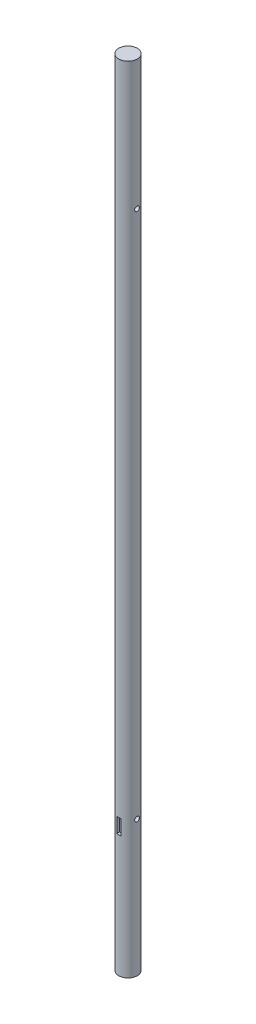
ISO-10303-21;
HEADER;
FILE_DESCRIPTION(('STEP AP214'),'2;1');
FILE_NAME('part.step','',(''),(''),'','','');
FILE_SCHEMA(('AUTOMOTIVE_DESIGN { 1 0 10303 214 1 1 1 1 }'));
ENDSEC;
DATA;
#1=APPLICATION_CONTEXT('core data for automotive mechanical design processes');
#2=APPLICATION_PROTOCOL_DEFINITION('international standard','automotive_design',2000,#1);
#3=PRODUCT_CONTEXT('',#1,'mechanical');
#4=PRODUCT('Part','Part','',(#3));
#5=PRODUCT_RELATED_PRODUCT_CATEGORY('part','',(#4));
#6=PRODUCT_DEFINITION_FORMATION('','',#4);
#7=PRODUCT_DEFINITION_CONTEXT('part definition',#1,'design');
#8=PRODUCT_DEFINITION('design','',#6,#7);
#9=PRODUCT_DEFINITION_SHAPE('','',#8);
#10=(LENGTH_UNIT() NAMED_UNIT(*) SI_UNIT(.MILLI.,.METRE.));
#11=(NAMED_UNIT(*) PLANE_ANGLE_UNIT() SI_UNIT($,.RADIAN.));
#12=(NAMED_UNIT(*) SI_UNIT($,.STERADIAN.) SOLID_ANGLE_UNIT());
#13=UNCERTAINTY_MEASURE_WITH_UNIT(LENGTH_MEASURE(1.E-05),#10,'distance_accuracy_value','');
#14=(GEOMETRIC_REPRESENTATION_CONTEXT(3) GLOBAL_UNCERTAINTY_ASSIGNED_CONTEXT((#13)) GLOBAL_UNIT_ASSIGNED_CONTEXT((#10,
#11,#12)) REPRESENTATION_CONTEXT('',''));
#15=CARTESIAN_POINT('',(0.,0.,0.));
#16=DIRECTION('',(0.,0.,1.));
#17=DIRECTION('',(1.,0.,0.));
#18=AXIS2_PLACEMENT_3D('',#15,#16,#17);
#19=CARTESIAN_POINT('',(0.,1600.,0.));
#20=DIRECTION('',(0.,-1.,0.));
#21=DIRECTION('',(0.,0.,-1.));
#22=AXIS2_PLACEMENT_3D('',#19,#20,#21);
#23=CYLINDRICAL_SURFACE('',#22,18.75);
#24=CARTESIAN_POINT('',(-18.75,1333.7975,0.));
#25=CARTESIAN_POINT('',(-18.7499956498863,1333.79750712746,-0.262993618249077));
#26=CARTESIAN_POINT('',(-18.7444117782007,1333.81935768293,-0.526066057474243));
#27=CARTESIAN_POINT('',(-18.7226779536651,1333.90604610928,-1.04466217030654));
#28=CARTESIAN_POINT('',(-18.7065222249169,1333.97090747923,-1.30018163756687));
#29=CARTESIAN_POINT('',(-18.6654323155867,1334.14139518578,-1.7961086949405));
#30=CARTESIAN_POINT('',(-18.6405088635419,1334.24697171679,-2.03653433265144));
#31=CARTESIAN_POINT('',(-18.5845330665217,1334.4957153675,-2.49626318263941));
#32=CARTESIAN_POINT('',(-18.5534804667271,1334.63888405017,-2.71556551615116));
#33=CARTESIAN_POINT('',(-18.4878768948386,1334.96195463644,-3.13147328009704));
#34=CARTESIAN_POINT('',(-18.4532705620118,1335.14250415991,-3.32756693949907));
#35=CARTESIAN_POINT('',(-18.3848247442538,1335.53382524314,-3.68704169111168));
#36=CARTESIAN_POINT('',(-18.3509853490632,1335.74460031873,-3.85041897247021));
#37=CARTESIAN_POINT('',(-18.2873448044607,1336.19438915472,-4.14225086158357));
#38=CARTESIAN_POINT('',(-18.2576138363475,1336.43378766201,-4.27012917342949));
#39=CARTESIAN_POINT('',(-18.2063653200901,1336.93156177627,-4.48362568775791));
#40=CARTESIAN_POINT('',(-18.184846412265,1337.18993423325,-4.56925088682912));
#41=CARTESIAN_POINT('',(-18.1530280610375,1337.71268495611,-4.69405731561));
#42=CARTESIAN_POINT('',(-18.1425062450035,1337.97682924112,-4.73416054769972));
#43=CARTESIAN_POINT('',(-18.1332080653267,1338.50828987065,-4.76965717287876));
#44=CARTESIAN_POINT('',(-18.1344297250435,1338.77560567378,-4.76505809017799));
#45=CARTESIAN_POINT('',(-18.1482807711457,1339.29872461741,-4.71201540420198));
#46=CARTESIAN_POINT('',(-18.1606232570157,1339.55464834779,-4.66467441542128));
#47=CARTESIAN_POINT('',(-18.1948675423693,1340.0547965968,-4.529252322924));
#48=CARTESIAN_POINT('',(-18.2167700423947,1340.29902025662,-4.44116823359355));
#49=CARTESIAN_POINT('',(-18.2679272240216,1340.77177296687,-4.22583040076505));
#50=CARTESIAN_POINT('',(-18.2972558371072,1341.00011286664,-4.09817969831814));
#51=CARTESIAN_POINT('',(-18.3599193828103,1341.43252490685,-3.80760962956653));
#52=CARTESIAN_POINT('',(-18.3932550367408,1341.63659266485,-3.64468390911577));
#53=CARTESIAN_POINT('',(-18.4613813509344,1342.02098196775,-3.28249451712199));
#54=CARTESIAN_POINT('',(-18.4961859381833,1342.20042643566,-3.08230142879544));
#55=CARTESIAN_POINT('',(-18.5624437536014,1342.52336601453,-2.65424503877228));
#56=CARTESIAN_POINT('',(-18.5938968727751,1342.66685995652,-2.42638083767948));
#57=CARTESIAN_POINT('',(-18.6500727071844,1342.91416218477,-1.94817401280542));
#58=CARTESIAN_POINT('',(-18.674770521735,1343.01782420018,-1.69775263073237));
#59=CARTESIAN_POINT('',(-18.7144721803579,1343.18133296329,-1.18226997587645));
#60=CARTESIAN_POINT('',(-18.729477940307,1343.24118837077,-0.917211607711538));
#61=CARTESIAN_POINT('',(-18.7478197680714,1343.31403655094,-0.387474645550518));
#62=CARTESIAN_POINT('',(-18.7514530791963,1343.32822326106,-0.122970287608625));
#63=CARTESIAN_POINT('',(-18.7474891106675,1343.31261127999,0.404634350488734));
#64=CARTESIAN_POINT('',(-18.7398928768053,1343.2828166847,0.667734759101962));
#65=CARTESIAN_POINT('',(-18.7145141873443,1343.18107090993,1.18088779336107));
#66=CARTESIAN_POINT('',(-18.6968900364678,1343.10977450071,1.43107878463828));
#67=CARTESIAN_POINT('',(-18.6534447093839,1342.9277997552,1.91593397218049));
#68=CARTESIAN_POINT('',(-18.6276226902461,1342.81711736898,2.15059656876791));
#69=CARTESIAN_POINT('',(-18.5699375889345,1342.55722204578,2.60245803441006));
#70=CARTESIAN_POINT('',(-18.5379731680015,1342.40734488924,2.81926161587298));
#71=CARTESIAN_POINT('',(-18.471703024662,1342.07416017813,3.22506366917098));
#72=CARTESIAN_POINT('',(-18.4373968851515,1341.89084665813,3.41405716849244));
#73=CARTESIAN_POINT('',(-18.3692342168533,1341.49044222684,3.76382066038847));
#74=CARTESIAN_POINT('',(-18.335411236728,1341.27261168546,3.92375192074105));
#75=CARTESIAN_POINT('',(-18.2730132418387,1340.81250339591,4.20479390431572));
#76=CARTESIAN_POINT('',(-18.2444379962126,1340.57022672393,4.32590633545797));
#77=CARTESIAN_POINT('',(-18.196089627051,1340.06938714157,4.52496628090202));
#78=CARTESIAN_POINT('',(-18.1762645932386,1339.81093095712,4.6031690472031));
#79=CARTESIAN_POINT('',(-18.1476194807122,1339.28395619481,4.71484821792432));
#80=CARTESIAN_POINT('',(-18.1387969020621,1339.01543991707,4.74833478271257));
#81=CARTESIAN_POINT('',(-18.1333505136191,1338.4845139955,4.76908729521345));
#82=CARTESIAN_POINT('',(-18.1363724387453,1338.22215962443,4.75769548701856));
#83=CARTESIAN_POINT('',(-18.1534530586462,1337.70324436428,4.69209632919892));
#84=CARTESIAN_POINT('',(-18.1675115175998,1337.44668335153,4.63788989440771));
#85=CARTESIAN_POINT('',(-18.2048805096093,1336.94815092884,4.48894412822459));
#86=CARTESIAN_POINT('',(-18.228131758468,1336.70609726017,4.39446422071157));
#87=CARTESIAN_POINT('',(-18.281273133895,1336.241101456,4.16785757028521));
#88=CARTESIAN_POINT('',(-18.3111642102766,1336.01816206109,4.03572544053554));
#89=CARTESIAN_POINT('',(-18.3752209781056,1335.59125557792,3.73339002067371));
#90=CARTESIAN_POINT('',(-18.4094799634597,1335.3879594258,3.56225896868237));
#91=CARTESIAN_POINT('',(-18.4778641545165,1335.01253306875,3.18858126717575));
#92=CARTESIAN_POINT('',(-18.511989326342,1334.84041031306,2.98602713016889));
#93=CARTESIAN_POINT('',(-18.5770294024012,1334.52904483705,2.5506419389618));
#94=CARTESIAN_POINT('',(-18.607871614748,1334.39048352761,2.31731187061552));
#95=CARTESIAN_POINT('',(-18.6620975101127,1334.15477313073,1.82990427397952));
#96=CARTESIAN_POINT('',(-18.6854864054118,1334.05759508693,1.57584140149858));
#97=CARTESIAN_POINT('',(-18.7188134137392,1333.92142743101,1.10195225387384));
#98=CARTESIAN_POINT('',(-18.7304269191351,1333.87505681853,0.884335172620964));
#99=CARTESIAN_POINT('',(-18.7460217439955,1333.81309132729,0.444497248049597));
#100=CARTESIAN_POINT('',(-18.7500036766263,1333.79749397602,0.222276776045352));
#101=CARTESIAN_POINT('',(-18.75,1333.7975,0.));
#102=B_SPLINE_CURVE_WITH_KNOTS('',3,(#24,#25,#26,#27,#28,#29,#30,#31,#32,#33,#34,#35,#36,#37,
#38,#39,#40,#41,#42,#43,#44,#45,#46,#47,#48,#49,#50,#51,#52,#53,#54,#55,#56,#57,#58,#59,#60,#61,
#62,#63,#64,#65,#66,#67,#68,#69,#70,#71,#72,#73,#74,#75,#76,#77,#78,#79,#80,#81,#82,#83,#84,#85,
#86,#87,#88,#89,#90,#91,#92,#93,#94,#95,#96,#97,#98,#99,#100,#101),.UNSPECIFIED.,.T.,.F.,(4,2,2,
2,2,2,2,2,2,2,2,2,2,2,2,2,2,2,2,2,2,2,2,2,2,2,2,2,2,2,2,2,2,2,2,2,2,2,4),(0.,0.788166156437042,
1.57676328471038,2.36439879134056,3.15206705080354,3.95473556235158,4.75749751559844,
5.57261678252078,6.38760103052476,7.18576635861262,7.98379734333403,8.76181188104456,
9.53988343992068,10.3260286416716,11.1123155710209,11.9217754126391,12.7312615712346,
13.5436925464945,14.3559628752787,15.146817504299,15.9375984868084,16.7162291133077,
17.4949398269732,18.2878146339146,19.0808310370768,19.8939884656592,20.707110112671,
21.5153408934219,22.3233879975614,23.1074538242315,23.8915028979746,24.6705760324132,
25.4497606834655,26.2498867759458,27.0502038161126,27.8656162468153,28.6804571824867,
29.3466524727938,30.0127942347393),.UNSPECIFIED.);
#103=CARTESIAN_POINT('',(-18.75,1333.7975,0.));
#104=VERTEX_POINT('',#103);
#105=EDGE_CURVE('E11',#104,#104,#102,.T.);
#106=ORIENTED_EDGE('',*,*,#105,.T.);
#107=EDGE_LOOP('',(#106));
#108=FACE_BOUND('',#107,.T.);
#109=CARTESIAN_POINT('',(18.1350790941203,1338.56,-4.76250000000006));
#110=CARTESIAN_POINT('',(18.1350840232791,1338.29716070885,-4.76249278384175));
#111=CARTESIAN_POINT('',(18.1408556693656,1338.03424241254,-4.7406669840311));
#112=CARTESIAN_POINT('',(18.1632573253463,1337.51596604457,-4.65408578491313));
#113=CARTESIAN_POINT('',(18.1798934485058,1337.26061231398,-4.58930621590089));
#114=CARTESIAN_POINT('',(18.2220210958878,1336.76503679324,-4.41905754600954));
#115=CARTESIAN_POINT('',(18.247500946094,1336.5247955455,-4.31364206570295));
#116=CARTESIAN_POINT('',(18.3044304977109,1336.06537915195,-4.06527837377646));
#117=CARTESIAN_POINT('',(18.3358805025385,1335.84620507768,-3.92232825441931));
#118=CARTESIAN_POINT('',(18.4020064649526,1335.43016729564,-3.59948465510579));
#119=CARTESIAN_POINT('',(18.4367353109821,1335.23385262652,-3.41889433991612));
#120=CARTESIAN_POINT('',(18.5050476371812,1334.87394712047,-3.02739704454027));
#121=CARTESIAN_POINT('',(18.5386310073552,1334.71035941887,-2.81648716296511));
#122=CARTESIAN_POINT('',(18.6014547773595,1334.41829507181,-2.36656561755999));
#123=CARTESIAN_POINT('',(18.6306254928042,1334.29035931009,-2.1271922687535));
#124=CARTESIAN_POINT('',(18.6807330148893,1334.07674981584,-1.62947199037149));
#125=CARTESIAN_POINT('',(18.7016710767475,1333.99106964015,-1.37112796035547));
#126=CARTESIAN_POINT('',(18.7325802344397,1333.86616635806,-0.848525212785491));
#127=CARTESIAN_POINT('',(18.7427712079791,1333.8260105148,-0.584502651628614));
#128=CARTESIAN_POINT('',(18.7518047607337,1333.79036638311,-0.0532848837864862));
#129=CARTESIAN_POINT('',(18.7506490697218,1333.79487128625,0.213909833107982));
#130=CARTESIAN_POINT('',(18.737282581493,1333.84775320954,0.737412747324913));
#131=CARTESIAN_POINT('',(18.7253255481778,1333.89512321201,0.993830126861042));
#132=CARTESIAN_POINT('',(18.6919962826316,1334.03077008969,1.49495010084054));
#133=CARTESIAN_POINT('',(18.6706235403207,1334.11904918109,1.73965205982471));
#134=CARTESIAN_POINT('',(18.6204788916185,1334.33481294353,2.21302870978919));
#135=CARTESIAN_POINT('',(18.5916403468194,1334.46265284608,2.44153413831019));
#136=CARTESIAN_POINT('',(18.5296874262595,1334.75363912486,2.87419952702094));
#137=CARTESIAN_POINT('',(18.4965722856978,1334.91679181977,3.0783551200384));
#138=CARTESIAN_POINT('',(18.4285792892393,1335.27915849352,3.46253267789726));
#139=CARTESIAN_POINT('',(18.3936780323407,1335.47925208535,3.64172173493411));
#140=CARTESIAN_POINT('',(18.3268896015694,1335.90701332632,3.9641912721064));
#141=CARTESIAN_POINT('',(18.2950025781184,1336.13468235028,4.10746996076754));
#142=CARTESIAN_POINT('',(18.2377667445291,1336.61280580133,4.35460820210048));
#143=CARTESIAN_POINT('',(18.2124524076859,1336.86337140322,4.4582612095122));
#144=CARTESIAN_POINT('',(18.1716668448211,1337.37917158893,4.62170939528255));
#145=CARTESIAN_POINT('',(18.1561934351495,1337.64440290429,4.68151430375489));
#146=CARTESIAN_POINT('',(18.1373016311342,1338.17426594969,4.75417413390824));
#147=CARTESIAN_POINT('',(18.133566460057,1338.43871735475,4.7682631279792));
#148=CARTESIAN_POINT('',(18.137710736794,1338.96619402345,4.75247479032553));
#149=CARTESIAN_POINT('',(18.1455890769031,1339.2292194207,4.72260165174152));
#150=CARTESIAN_POINT('',(18.1717685547933,1339.74175511577,4.62082050101553));
#151=CARTESIAN_POINT('',(18.1898900501808,1339.99141923199,4.54963643182574));
#152=CARTESIAN_POINT('',(18.2343422874638,1340.47526962722,4.36805938518873));
#153=CARTESIAN_POINT('',(18.2606740257214,1340.70945402349,4.25766164870211));
#154=CARTESIAN_POINT('',(18.3192428392186,1341.16091076694,3.99822634434617));
#155=CARTESIAN_POINT('',(18.351588353011,1341.37774650511,3.84845403876097));
#156=CARTESIAN_POINT('',(18.4182767433469,1341.78366096485,3.51544579687777));
#157=CARTESIAN_POINT('',(18.4526199585166,1341.97273496134,3.33220417593401));
#158=CARTESIAN_POINT('',(18.5205117088812,1342.32278681796,2.93178477271905));
#159=CARTESIAN_POINT('',(18.5540165695694,1342.48290935287,2.71385044655678));
#160=CARTESIAN_POINT('',(18.6155368857075,1342.76428752198,2.25347236951465));
#161=CARTESIAN_POINT('',(18.6435526296287,1342.88554519886,2.01102990763455));
#162=CARTESIAN_POINT('',(18.6907601643679,1343.0846828565,1.51020462078283));
#163=CARTESIAN_POINT('',(18.7100159289241,1343.16287823367,1.25195351996896));
#164=CARTESIAN_POINT('',(18.7378143444856,1343.27461161928,0.725420459169228));
#165=CARTESIAN_POINT('',(18.7463591342984,1343.30815854337,0.457140512802819));
#166=CARTESIAN_POINT('',(18.7516823114806,1343.32912774451,-0.0738100545499679));
#167=CARTESIAN_POINT('',(18.7487822451389,1343.31781045281,-0.336428414374281));
#168=CARTESIAN_POINT('',(18.7322579216821,1343.25226875242,-0.855892018691095));
#169=CARTESIAN_POINT('',(18.7186340025078,1343.19804569582,-1.11273744484369));
#170=CARTESIAN_POINT('',(18.6822458632328,1343.04891658113,-1.61199861788453));
#171=CARTESIAN_POINT('',(18.6595343724839,1342.9542450087,-1.85448850029879));
#172=CARTESIAN_POINT('',(18.6073585866202,1342.7271179552,-2.32027966170035));
#173=CARTESIAN_POINT('',(18.5778934166715,1342.59465757865,-2.5435784496235));
#174=CARTESIAN_POINT('',(18.5144759366867,1342.29190534479,-2.97060016732835));
#175=CARTESIAN_POINT('',(18.4804310579245,1342.12076282554,-3.17370623626745));
#176=CARTESIAN_POINT('',(18.412097483349,1341.74714700891,-3.54874405166371));
#177=CARTESIAN_POINT('',(18.3778087274334,1341.54466571362,-3.72066781575841));
#178=CARTESIAN_POINT('',(18.3121094314498,1341.10938650883,-4.03174583249094));
#179=CARTESIAN_POINT('',(18.2807677286439,1340.8760761563,-4.17019876157238));
#180=CARTESIAN_POINT('',(18.225447664527,1340.38872632612,-4.40571154055518));
#181=CARTESIAN_POINT('',(18.2014640740766,1340.13470173258,-4.50280080524926));
#182=CARTESIAN_POINT('',(18.1672269551572,1339.66102854693,-4.63878176807623));
#183=CARTESIAN_POINT('',(18.1552637964512,1339.44359872545,-4.68507318409058));
#184=CARTESIAN_POINT('',(18.139188142582,1339.00413112327,-4.74693394326758));
#185=CARTESIAN_POINT('',(18.135074929083,1338.78209376609,-4.76250609750462));
#186=CARTESIAN_POINT('',(18.1350790941203,1338.56,-4.76250000000006));
#187=B_SPLINE_CURVE_WITH_KNOTS('',3,(#109,#110,#111,#112,#113,#114,#115,#116,#117,#118,#119,
#120,#121,#122,#123,#124,#125,#126,#127,#128,#129,#130,#131,#132,#133,#134,#135,#136,#137,#138,
#139,#140,#141,#142,#143,#144,#145,#146,#147,#148,#149,#150,#151,#152,#153,#154,#155,#156,#157,
#158,#159,#160,#161,#162,#163,#164,#165,#166,#167,#168,#169,#170,#171,#172,#173,#174,#175,#176,
#177,#178,#179,#180,#181,#182,#183,#184,#185,#186),.UNSPECIFIED.,.T.,.F.,(4,2,2,2,2,2,2,2,2,2,2,
2,2,2,2,2,2,2,2,2,2,2,2,2,2,2,2,2,2,2,2,2,2,2,2,2,2,2,4),(0.,0.787702028900706,1.57584766730428,
2.36295685909409,3.15010606427788,3.9533809678661,4.75673279096744,5.57168037278601,
6.38650365278424,7.18431213789905,7.98199900083229,8.76141912804849,9.54088148421008,
10.3275566322943,11.1143726600236,11.9231555335073,12.7319787470247,13.5449621904392,
14.357765174092,15.1484361283671,15.9390316727513,16.7161739301164,17.493410535071,
18.2863304890438,19.0793852431333,19.8929969115238,20.7065658104376,21.5140939204177,
22.3214607544599,23.1063081317562,23.8911307771508,24.6714641460416,25.4518986521462,
26.2515360153748,27.051377789854,27.8667545381526,28.6815504787595,29.3472033209905,
30.0127952474843),.UNSPECIFIED.);
#188=CARTESIAN_POINT('',(18.1350790941203,1338.56,-4.76250000000006));
#189=VERTEX_POINT('',#188);
#190=EDGE_CURVE('E68',#189,#189,#187,.T.);
#191=ORIENTED_EDGE('',*,*,#190,.T.);
#192=EDGE_LOOP('',(#191));
#193=FACE_BOUND('',#192,.T.);
#194=CARTESIAN_POINT('',(-18.75,268.7975,0.));
#195=CARTESIAN_POINT('',(-18.7499956498863,268.797507127463,-0.262993618249073));
#196=CARTESIAN_POINT('',(-18.7444117782007,268.819357682928,-0.526066057474233));
#197=CARTESIAN_POINT('',(-18.7226779536651,268.906046109277,-1.04466217030652));
#198=CARTESIAN_POINT('',(-18.7065222249169,268.970907479231,-1.30018163756685));
#199=CARTESIAN_POINT('',(-18.6654323155867,269.141395185775,-1.79610869494049));
#200=CARTESIAN_POINT('',(-18.6405088635419,269.246971716793,-2.03653433265144));
#201=CARTESIAN_POINT('',(-18.5845330665217,269.4957153675,-2.49626318263943));
#202=CARTESIAN_POINT('',(-18.5534804667271,269.638884050165,-2.7155655161512));
#203=CARTESIAN_POINT('',(-18.4878768948385,269.961954636444,-3.13147328009712));
#204=CARTESIAN_POINT('',(-18.4532705620118,270.142504159907,-3.32756693949919));
#205=CARTESIAN_POINT('',(-18.3848247442538,270.533825243145,-3.68704169111178));
#206=CARTESIAN_POINT('',(-18.3509853490632,270.744600318734,-3.85041897247027));
#207=CARTESIAN_POINT('',(-18.2873448044607,271.194389154715,-4.14225086158357));
#208=CARTESIAN_POINT('',(-18.2576138363475,271.433787662007,-4.27012917342948));
#209=CARTESIAN_POINT('',(-18.2063653200901,271.931561776274,-4.4836256877579));
#210=CARTESIAN_POINT('',(-18.184846412265,272.189934233253,-4.5692508868291));
#211=CARTESIAN_POINT('',(-18.1530280610375,272.712684956113,-4.69405731560993));
#212=CARTESIAN_POINT('',(-18.1425062450035,272.976829241123,-4.73416054769964));
#213=CARTESIAN_POINT('',(-18.1332080653267,273.508289870651,-4.76965717287871));
#214=CARTESIAN_POINT('',(-18.1344297250435,273.77560567378,-4.76505809017793));
#215=CARTESIAN_POINT('',(-18.1482807711458,274.298724617411,-4.71201540420191));
#216=CARTESIAN_POINT('',(-18.1606232570157,274.554648347791,-4.6646744154212));
#217=CARTESIAN_POINT('',(-18.1948675423693,275.054796596804,-4.52925232292391));
#218=CARTESIAN_POINT('',(-18.2167700423947,275.29902025662,-4.44116823359346));
#219=CARTESIAN_POINT('',(-18.2679272240217,275.771772966865,-4.22583040076496));
#220=CARTESIAN_POINT('',(-18.2972558371072,276.000112866635,-4.09817969831802));
#221=CARTESIAN_POINT('',(-18.3599193828103,276.432524906854,-3.80760962956636));
#222=CARTESIAN_POINT('',(-18.3932550367408,276.636592664849,-3.64468390911561));
#223=CARTESIAN_POINT('',(-18.4613813509344,277.020981967754,-3.28249451712188));
#224=CARTESIAN_POINT('',(-18.4961859381833,277.200426435658,-3.08230142879538));
#225=CARTESIAN_POINT('',(-18.5624437536014,277.523366014526,-2.65424503877227));
#226=CARTESIAN_POINT('',(-18.5938968727751,277.666859956523,-2.42638083767947));
#227=CARTESIAN_POINT('',(-18.6500727071844,277.914162184767,-1.94817401280537));
#228=CARTESIAN_POINT('',(-18.674770521735,278.017824200177,-1.6977526307323));
#229=CARTESIAN_POINT('',(-18.7144721803579,278.181332963289,-1.18226997587631));
#230=CARTESIAN_POINT('',(-18.729477940307,278.241188370772,-0.917211607711362));
#231=CARTESIAN_POINT('',(-18.7478197680714,278.314036550939,-0.387474645550309));
#232=CARTESIAN_POINT('',(-18.7514530791963,278.328223261065,-0.122970287608426));
#233=CARTESIAN_POINT('',(-18.7474891106675,278.312611279985,0.4046343504889));
#234=CARTESIAN_POINT('',(-18.7398928768052,278.282816684696,0.667734759102105));
#235=CARTESIAN_POINT('',(-18.7145141873443,278.18107090993,1.18088779336118));
#236=CARTESIAN_POINT('',(-18.6968900364678,278.109774500713,1.43107878463838));
#237=CARTESIAN_POINT('',(-18.6534447093839,277.927799755201,1.91593397218059));
#238=CARTESIAN_POINT('',(-18.6276226902461,277.817117368978,2.15059656876802));
#239=CARTESIAN_POINT('',(-18.5699375889344,277.557222045777,2.60245803441013));
#240=CARTESIAN_POINT('',(-18.5379731680015,277.407344889244,2.819261615873));
#241=CARTESIAN_POINT('',(-18.471703024662,277.074160178129,3.22506366917097));
#242=CARTESIAN_POINT('',(-18.4373968851515,276.890846658132,3.41405716849246));
#243=CARTESIAN_POINT('',(-18.3692342168533,276.490442226844,3.76382066038847));
#244=CARTESIAN_POINT('',(-18.335411236728,276.272611685455,3.92375192074102));
#245=CARTESIAN_POINT('',(-18.2730132418387,275.812503395908,4.20479390431569));
#246=CARTESIAN_POINT('',(-18.2444379962126,275.570226723927,4.32590633545797));
#247=CARTESIAN_POINT('',(-18.196089627051,275.069387141572,4.52496628090204));
#248=CARTESIAN_POINT('',(-18.1762645932386,274.810930957119,4.60316904720313));
#249=CARTESIAN_POINT('',(-18.1476194807122,274.283956194814,4.71484821792434));
#250=CARTESIAN_POINT('',(-18.1387969020621,274.015439917067,4.74833478271258));
#251=CARTESIAN_POINT('',(-18.1333505136191,273.484513995499,4.76908729521344));
#252=CARTESIAN_POINT('',(-18.1363724387453,273.222159624427,4.75769548701856));
#253=CARTESIAN_POINT('',(-18.1534530586462,272.703244364275,4.69209632919895));
#254=CARTESIAN_POINT('',(-18.1675115175998,272.446683351527,4.63788989440773));
#255=CARTESIAN_POINT('',(-18.2048805096094,271.948150928839,4.48894412822456));
#256=CARTESIAN_POINT('',(-18.228131758468,271.706097260172,4.39446422071153));
#257=CARTESIAN_POINT('',(-18.281273133895,271.241101456004,4.16785757028518));
#258=CARTESIAN_POINT('',(-18.3111642102766,271.01816206109,4.03572544053552));
#259=CARTESIAN_POINT('',(-18.3752209781056,270.591255577922,3.73339002067369));
#260=CARTESIAN_POINT('',(-18.4094799634597,270.387959425796,3.56225896868232));
#261=CARTESIAN_POINT('',(-18.4778641545166,270.012533068747,3.18858126717565));
#262=CARTESIAN_POINT('',(-18.511989326342,269.840410313061,2.98602713016877));
#263=CARTESIAN_POINT('',(-18.5770294024012,269.529044837047,2.55064193896167));
#264=CARTESIAN_POINT('',(-18.607871614748,269.390483527606,2.31731187061541));
#265=CARTESIAN_POINT('',(-18.6620975101127,269.154773130729,1.82990427397946));
#266=CARTESIAN_POINT('',(-18.6854864054119,269.057595086929,1.57584140149854));
#267=CARTESIAN_POINT('',(-18.7188134137392,268.921427431009,1.10195225387381));
#268=CARTESIAN_POINT('',(-18.7304269191351,268.875056818531,0.884335172620934));
#269=CARTESIAN_POINT('',(-18.7460217439955,268.81309132729,0.444497248049572));
#270=CARTESIAN_POINT('',(-18.7500036766263,268.797493976015,0.222276776045339));
#271=CARTESIAN_POINT('',(-18.75,268.7975,0.));
#272=B_SPLINE_CURVE_WITH_KNOTS('',3,(#194,#195,#196,#197,#198,#199,#200,#201,#202,#203,#204,
#205,#206,#207,#208,#209,#210,#211,#212,#213,#214,#215,#216,#217,#218,#219,#220,#221,#222,#223,
#224,#225,#226,#227,#228,#229,#230,#231,#232,#233,#234,#235,#236,#237,#238,#239,#240,#241,#242,
#243,#244,#245,#246,#247,#248,#249,#250,#251,#252,#253,#254,#255,#256,#257,#258,#259,#260,#261,
#262,#263,#264,#265,#266,#267,#268,#269,#270,#271),.UNSPECIFIED.,.T.,.F.,(4,2,2,2,2,2,2,2,2,2,2,
2,2,2,2,2,2,2,2,2,2,2,2,2,2,2,2,2,2,2,2,2,2,2,2,2,2,2,4),(0.,0.788166156437031,1.5767632847104,
2.36439879134054,3.15206705080355,3.95473556235177,4.75749751559863,5.57261678252073,
6.38760103052486,7.18576635861228,7.98379734333386,8.76181188104467,9.53988343992067,
10.3260286416718,11.1123155710209,11.9217754126389,12.7312615712345,13.5436925464944,
14.3559628752787,15.146817504299,15.9375984868084,16.7162291133076,17.4949398269731,
18.2878146339144,19.0808310370767,19.8939884656589,20.7071101126708,21.5153408934218,
22.3233879975613,23.1074538242311,23.8915028979746,24.670576032413,25.4497606834653,
26.2498867759457,27.0502038161126,27.8656162468151,28.6804571824865,29.3466524727936,
30.0127942347391),.UNSPECIFIED.);
#273=CARTESIAN_POINT('',(-18.75,268.7975,0.));
#274=VERTEX_POINT('',#273);
#275=EDGE_CURVE('E236',#274,#274,#272,.T.);
#276=ORIENTED_EDGE('',*,*,#275,.T.);
#277=EDGE_LOOP('',(#276));
#278=FACE_BOUND('',#277,.T.);
#279=CARTESIAN_POINT('',(18.1350790941203,273.56,-4.7625));
#280=CARTESIAN_POINT('',(18.1350840232792,273.297160708853,-4.76249278384169));
#281=CARTESIAN_POINT('',(18.1408556693656,273.034242412541,-4.74066698403104));
#282=CARTESIAN_POINT('',(18.1632573253463,272.515966044568,-4.65408578491311));
#283=CARTESIAN_POINT('',(18.1798934485058,272.260612313981,-4.58930621590086));
#284=CARTESIAN_POINT('',(18.2220210958878,271.765036793236,-4.4190575460095));
#285=CARTESIAN_POINT('',(18.247500946094,271.524795545496,-4.31364206570288));
#286=CARTESIAN_POINT('',(18.3044304977109,271.065379151951,-4.06527837377639));
#287=CARTESIAN_POINT('',(18.3358805025385,270.846205077681,-3.92232825441926));
#288=CARTESIAN_POINT('',(18.4020064649526,270.430167295636,-3.59948465510578));
#289=CARTESIAN_POINT('',(18.4367353109821,270.233852626524,-3.41889433991612));
#290=CARTESIAN_POINT('',(18.5050476371812,269.873947120465,-3.02739704454027));
#291=CARTESIAN_POINT('',(18.5386310073552,269.710359418869,-2.81648716296509));
#292=CARTESIAN_POINT('',(18.6014547773595,269.418295071805,-2.36656561756));
#293=CARTESIAN_POINT('',(18.6306254928042,269.290359310094,-2.12719226875357));
#294=CARTESIAN_POINT('',(18.6807330148893,269.076749815839,-1.62947199037159));
#295=CARTESIAN_POINT('',(18.7016710767475,268.991069640154,-1.37112796035555));
#296=CARTESIAN_POINT('',(18.7325802344397,268.866166358064,-0.848525212785571));
#297=CARTESIAN_POINT('',(18.7427712079791,268.826010514803,-0.5845026516287));
#298=CARTESIAN_POINT('',(18.7518047607337,268.790366383108,-0.0532848837865789));
#299=CARTESIAN_POINT('',(18.7506490697218,268.794871286246,0.213909833107889));
#300=CARTESIAN_POINT('',(18.737282581493,268.847753209538,0.73741274732483));
#301=CARTESIAN_POINT('',(18.7253255481778,268.895123212011,0.99383012686097));
#302=CARTESIAN_POINT('',(18.6919962826316,269.030770089692,1.49495010084046));
#303=CARTESIAN_POINT('',(18.6706235403207,269.119049181093,1.73965205982461));
#304=CARTESIAN_POINT('',(18.6204788916186,269.334812943526,2.21302870978909));
#305=CARTESIAN_POINT('',(18.5916403468194,269.462652846076,2.44153413831012));
#306=CARTESIAN_POINT('',(18.5296874262596,269.753639124865,2.87419952702091));
#307=CARTESIAN_POINT('',(18.4965722856978,269.916791819771,3.07835512003836));
#308=CARTESIAN_POINT('',(18.4285792892393,270.279158493521,3.46253267789721));
#309=CARTESIAN_POINT('',(18.3936780323407,270.479252085349,3.64172173493406));
#310=CARTESIAN_POINT('',(18.3268896015694,270.907013326317,3.96419127210634));
#311=CARTESIAN_POINT('',(18.2950025781184,271.134682350282,4.10746996076747));
#312=CARTESIAN_POINT('',(18.2377667445291,271.612805801331,4.35460820210044));
#313=CARTESIAN_POINT('',(18.2124524076859,271.863371403222,4.45826120951216));
#314=CARTESIAN_POINT('',(18.1716668448212,272.379171588928,4.62170939528252));
#315=CARTESIAN_POINT('',(18.1561934351495,272.644402904291,4.68151430375486));
#316=CARTESIAN_POINT('',(18.1373016311342,273.174265949687,4.75417413390822));
#317=CARTESIAN_POINT('',(18.133566460057,273.438717354746,4.7682631279792));
#318=CARTESIAN_POINT('',(18.137710736794,273.966194023446,4.75247479032553));
#319=CARTESIAN_POINT('',(18.1455890769031,274.229219420699,4.72260165174149));
#320=CARTESIAN_POINT('',(18.1717685547933,274.74175511577,4.6208205010155));
#321=CARTESIAN_POINT('',(18.1898900501808,274.991419231989,4.54963643182573));
#322=CARTESIAN_POINT('',(18.2343422874638,275.475269627219,4.36805938518874));
#323=CARTESIAN_POINT('',(18.2606740257215,275.709454023491,4.2576616487021));
#324=CARTESIAN_POINT('',(18.3192428392186,276.160910766944,3.99822634434615));
#325=CARTESIAN_POINT('',(18.351588353011,276.37774650511,3.84845403876097));
#326=CARTESIAN_POINT('',(18.4182767433469,276.783660964851,3.51544579687782));
#327=CARTESIAN_POINT('',(18.4526199585166,276.972734961336,3.3322041759341));
#328=CARTESIAN_POINT('',(18.5205117088812,277.322786817958,2.93178477271918));
#329=CARTESIAN_POINT('',(18.5540165695694,277.482909352873,2.71385044655692));
#330=CARTESIAN_POINT('',(18.6155368857075,277.764287521981,2.25347236951477));
#331=CARTESIAN_POINT('',(18.6435526296287,277.885545198864,2.01102990763465));
#332=CARTESIAN_POINT('',(18.6907601643679,278.084682856498,1.51020462078292));
#333=CARTESIAN_POINT('',(18.7100159289241,278.162878233667,1.25195351996907));
#334=CARTESIAN_POINT('',(18.7378143444856,278.274611619275,0.725420459169377));
#335=CARTESIAN_POINT('',(18.7463591342984,278.308158543367,0.457140512802997));
#336=CARTESIAN_POINT('',(18.7516823114806,278.329127744509,-0.0738100545497722));
#337=CARTESIAN_POINT('',(18.7487822451389,278.317810452811,-0.336428414374094));
#338=CARTESIAN_POINT('',(18.7322579216821,278.252268752422,-0.855892018690936));
#339=CARTESIAN_POINT('',(18.7186340025078,278.19804569582,-1.11273744484355));
#340=CARTESIAN_POINT('',(18.6822458632328,278.048916581133,-1.6119986178844));
#341=CARTESIAN_POINT('',(18.6595343724839,277.954245008695,-1.85448850029864));
#342=CARTESIAN_POINT('',(18.6073585866202,277.7271179552,-2.32027966170021));
#343=CARTESIAN_POINT('',(18.5778934166715,277.594657578647,-2.5435784496234));
#344=CARTESIAN_POINT('',(18.5144759366867,277.291905344794,-2.9706001673282));
#345=CARTESIAN_POINT('',(18.4804310579245,277.120762825544,-3.17370623626723));
#346=CARTESIAN_POINT('',(18.412097483349,276.747147008909,-3.54874405166351));
#347=CARTESIAN_POINT('',(18.3778087274335,276.544665713622,-3.72066781575826));
#348=CARTESIAN_POINT('',(18.3121094314499,276.109386508831,-4.03174583249083));
#349=CARTESIAN_POINT('',(18.2807677286439,275.876076156298,-4.17019876157226));
#350=CARTESIAN_POINT('',(18.225447664527,275.388726326115,-4.40571154055509));
#351=CARTESIAN_POINT('',(18.2014640740766,275.134701732579,-4.50280080524919));
#352=CARTESIAN_POINT('',(18.1672269551573,274.661028546929,-4.63878176807617));
#353=CARTESIAN_POINT('',(18.1552637964512,274.443598725446,-4.68507318409054));
#354=CARTESIAN_POINT('',(18.139188142582,274.004131123271,-4.74693394326753));
#355=CARTESIAN_POINT('',(18.135074929083,273.782093766087,-4.76250609750456));
#356=CARTESIAN_POINT('',(18.1350790941203,273.56,-4.7625));
#357=B_SPLINE_CURVE_WITH_KNOTS('',3,(#279,#280,#281,#282,#283,#284,#285,#286,#287,#288,#289,
#290,#291,#292,#293,#294,#295,#296,#297,#298,#299,#300,#301,#302,#303,#304,#305,#306,#307,#308,
#309,#310,#311,#312,#313,#314,#315,#316,#317,#318,#319,#320,#321,#322,#323,#324,#325,#326,#327,
#328,#329,#330,#331,#332,#333,#334,#335,#336,#337,#338,#339,#340,#341,#342,#343,#344,#345,#346,
#347,#348,#349,#350,#351,#352,#353,#354,#355,#356),.UNSPECIFIED.,.T.,.F.,(4,2,2,2,2,2,2,2,2,2,2,
2,2,2,2,2,2,2,2,2,2,2,2,2,2,2,2,2,2,2,2,2,2,2,2,2,2,2,4),(0.,0.787702028900483,1.57584766730416,
2.36295685909421,3.15010606427786,3.95338096786598,4.75673279096733,5.57168037278588,
6.38650365278403,7.18431213789887,7.9819990008321,8.76141912804828,9.5408814842099,
10.3275566322941,11.1143726600235,11.9231555335072,12.7319787470244,13.544962190439,
14.3577651740919,15.148436128367,15.9390316727513,16.7161739301163,17.493410535071,
18.2863304890436,19.079385243133,19.8929969115235,20.7065658104374,21.5140939204174,
22.3214607544595,23.1063081317558,23.8911307771505,24.6714641460414,25.4518986521459,
26.2515360153743,27.0513777898538,27.8667545381522,28.6815504787594,29.3472033209904,
30.012795247484),.UNSPECIFIED.);
#358=CARTESIAN_POINT('',(18.1350790941203,273.56,-4.7625));
#359=VERTEX_POINT('',#358);
#360=EDGE_CURVE('E228',#359,#359,#357,.T.);
#361=ORIENTED_EDGE('',*,*,#360,.T.);
#362=EDGE_LOOP('',(#361));
#363=FACE_BOUND('',#362,.T.);
#364=CARTESIAN_POINT('',(0.,276.062165694477,0.));
#365=DIRECTION('',(0.,1.,0.));
#366=DIRECTION('',(0.,0.,1.));
#367=AXIS2_PLACEMENT_3D('',#364,#365,#366);
#368=CIRCLE('',#367,18.75);
#369=CARTESIAN_POINT('',(-4.07499999999983,276.062165694477,18.3018270945827));
#370=VERTEX_POINT('',#369);
#371=CARTESIAN_POINT('',(4.07500000000017,276.062165694477,18.3018270945826));
#372=VERTEX_POINT('',#371);
#373=EDGE_CURVE('E205',#370,#372,#368,.T.);
#374=ORIENTED_EDGE('',*,*,#373,.T.);
#375=DIRECTION('',(0.,-1.,0.));
#376=VECTOR('',#375,1.);
#377=CARTESIAN_POINT('',(4.07500000000017,1600.,18.3018270945826));
#378=LINE('',#377,#376);
#379=CARTESIAN_POINT('',(4.07500000000017,246.062165694477,18.3018270945826));
#380=VERTEX_POINT('',#379);
#381=EDGE_CURVE('E212',#372,#380,#378,.T.);
#382=ORIENTED_EDGE('',*,*,#381,.T.);
#383=CARTESIAN_POINT('',(0.,246.062165694477,0.));
#384=DIRECTION('',(0.,-1.,0.));
#385=DIRECTION('',(0.,0.,-1.));
#386=AXIS2_PLACEMENT_3D('',#383,#384,#385);
#387=CIRCLE('',#386,18.75);
#388=CARTESIAN_POINT('',(-4.07499999999983,246.062165694477,18.3018270945827));
#389=VERTEX_POINT('',#388);
#390=EDGE_CURVE('E198',#380,#389,#387,.T.);
#391=ORIENTED_EDGE('',*,*,#390,.T.);
#392=DIRECTION('',(0.,-1.,0.));
#393=VECTOR('',#392,1.);
#394=CARTESIAN_POINT('',(-4.07499999999983,1600.,18.3018270945827));
#395=LINE('',#394,#393);
#396=EDGE_CURVE('E208',#389,#370,#395,.F.);
#397=ORIENTED_EDGE('',*,*,#396,.T.);
#398=EDGE_LOOP('',(#374,#382,#391,#397));
#399=FACE_BOUND('',#398,.T.);
#400=CARTESIAN_POINT('',(0.,1600.,0.));
#401=DIRECTION('',(0.,1.,0.));
#402=DIRECTION('',(0.,0.,1.));
#403=AXIS2_PLACEMENT_3D('',#400,#401,#402);
#404=CIRCLE('',#403,18.75);
#405=CARTESIAN_POINT('',(0.,1600.,18.75));
#406=VERTEX_POINT('',#405);
#407=EDGE_CURVE('E194',#406,#406,#404,.T.);
#408=ORIENTED_EDGE('',*,*,#407,.F.);
#409=EDGE_LOOP('',(#408));
#410=FACE_BOUND('',#409,.T.);
#411=CARTESIAN_POINT('',(0.,0.,0.));
#412=DIRECTION('',(0.,1.,0.));
#413=DIRECTION('',(0.,0.,1.));
#414=AXIS2_PLACEMENT_3D('',#411,#412,#413);
#415=CIRCLE('',#414,18.75);
#416=CARTESIAN_POINT('',(0.,0.,18.75));
#417=VERTEX_POINT('',#416);
#418=EDGE_CURVE('E183',#417,#417,#415,.T.);
#419=ORIENTED_EDGE('',*,*,#418,.T.);
#420=EDGE_LOOP('',(#419));
#421=FACE_BOUND('',#420,.T.);
#422=CARTESIAN_POINT('',(0.,246.062165694477,0.));
#423=DIRECTION('',(0.,1.,0.));
#424=DIRECTION('',(0.,0.,1.));
#425=AXIS2_PLACEMENT_3D('',#422,#423,#424);
#426=CIRCLE('',#425,18.75);
#427=CARTESIAN_POINT('',(4.07500000000017,246.062165694477,-18.3018270945826));
#428=VERTEX_POINT('',#427);
#429=CARTESIAN_POINT('',(-4.07499999999983,246.062165694477,-18.3018270945827));
#430=VERTEX_POINT('',#429);
#431=EDGE_CURVE('E219',#428,#430,#426,.T.);
#432=ORIENTED_EDGE('',*,*,#431,.F.);
#433=DIRECTION('',(0.,-1.,0.));
#434=VECTOR('',#433,1.);
#435=CARTESIAN_POINT('',(4.07500000000017,1600.,-18.3018270945826));
#436=LINE('',#435,#434);
#437=CARTESIAN_POINT('',(4.07500000000017,276.062165694477,-18.3018270945826));
#438=VERTEX_POINT('',#437);
#439=EDGE_CURVE('E224',#438,#428,#436,.T.);
#440=ORIENTED_EDGE('',*,*,#439,.F.);
#441=CARTESIAN_POINT('',(0.,276.062165694477,0.));
#442=DIRECTION('',(0.,-1.,0.));
#443=DIRECTION('',(0.,0.,-1.));
#444=AXIS2_PLACEMENT_3D('',#441,#442,#443);
#445=CIRCLE('',#444,18.75);
#446=CARTESIAN_POINT('',(-4.07499999999983,276.062165694477,-18.3018270945827));
#447=VERTEX_POINT('',#446);
#448=EDGE_CURVE('E216',#447,#438,#445,.T.);
#449=ORIENTED_EDGE('',*,*,#448,.F.);
#450=DIRECTION('',(0.,-1.,0.));
#451=VECTOR('',#450,1.);
#452=CARTESIAN_POINT('',(-4.07499999999983,1600.,-18.3018270945827));
#453=LINE('',#452,#451);
#454=EDGE_CURVE('E141',#430,#447,#453,.F.);
#455=ORIENTED_EDGE('',*,*,#454,.F.);
#456=EDGE_LOOP('',(#432,#440,#449,#455));
#457=FACE_BOUND('',#456,.T.);
#458=ADVANCED_FACE('F55',(#108,#193,#278,#363,#399,#410,#421,#457),#23,.T.);
#459=CARTESIAN_POINT('',(0.,1600.,0.));
#460=DIRECTION('',(0.,1.,0.));
#461=DIRECTION('',(0.,0.,1.));
#462=AXIS2_PLACEMENT_3D('',#459,#460,#461);
#463=PLANE('',#462);
#464=ORIENTED_EDGE('',*,*,#407,.T.);
#465=EDGE_LOOP('',(#464));
#466=FACE_BOUND('',#465,.T.);
#467=ADVANCED_FACE('F282',(#466),#463,.T.);
#468=CARTESIAN_POINT('',(0.,0.,0.));
#469=DIRECTION('',(0.,1.,0.));
#470=DIRECTION('',(0.,0.,1.));
#471=AXIS2_PLACEMENT_3D('',#468,#469,#470);
#472=PLANE('',#471);
#473=ORIENTED_EDGE('',*,*,#418,.F.);
#474=EDGE_LOOP('',(#473));
#475=FACE_BOUND('',#474,.T.);
#476=ADVANCED_FACE('F280',(#475),#472,.F.);
#477=CARTESIAN_POINT('',(-4.07499999999983,246.062165694477,13.));
#478=DIRECTION('',(-1.,0.,0.));
#479=DIRECTION('',(0.,0.,1.));
#480=AXIS2_PLACEMENT_3D('',#477,#478,#479);
#481=PLANE('',#480);
#482=DIRECTION('',(0.,0.,1.));
#483=VECTOR('',#482,1.);
#484=CARTESIAN_POINT('',(-4.07499999999983,246.062165694477,13.));
#485=LINE('',#484,#483);
#486=CARTESIAN_POINT('',(-4.07499999999983,246.062165694477,13.));
#487=VERTEX_POINT('',#486);
#488=EDGE_CURVE('E83',#487,#389,#485,.T.);
#489=ORIENTED_EDGE('',*,*,#488,.F.);
#490=DIRECTION('',(0.,-1.,0.));
#491=VECTOR('',#490,1.);
#492=CARTESIAN_POINT('',(-4.07499999999983,246.062165694477,13.));
#493=LINE('',#492,#491);
#494=CARTESIAN_POINT('',(-4.07499999999983,276.062165694477,13.));
#495=VERTEX_POINT('',#494);
#496=EDGE_CURVE('E157',#495,#487,#493,.T.);
#497=ORIENTED_EDGE('',*,*,#496,.F.);
#498=DIRECTION('',(0.,0.,1.));
#499=VECTOR('',#498,1.);
#500=CARTESIAN_POINT('',(-4.07499999999983,276.062165694477,13.));
#501=LINE('',#500,#499);
#502=EDGE_CURVE('E179',#495,#370,#501,.T.);
#503=ORIENTED_EDGE('',*,*,#502,.T.);
#504=ORIENTED_EDGE('',*,*,#396,.F.);
#505=EDGE_LOOP('',(#489,#497,#503,#504));
#506=FACE_BOUND('',#505,.T.);
#507=ADVANCED_FACE('F271',(#506),#481,.F.);
#508=CARTESIAN_POINT('',(4.07500000000017,276.062165694477,13.));
#509=DIRECTION('',(0.,1.,0.));
#510=DIRECTION('',(0.,0.,1.));
#511=AXIS2_PLACEMENT_3D('',#508,#509,#510);
#512=PLANE('',#511);
#513=ORIENTED_EDGE('',*,*,#373,.F.);
#514=ORIENTED_EDGE('',*,*,#502,.F.);
#515=DIRECTION('',(-1.,0.,0.));
#516=VECTOR('',#515,1.);
#517=CARTESIAN_POINT('',(4.07500000000017,276.062165694477,13.));
#518=LINE('',#517,#516);
#519=CARTESIAN_POINT('',(4.07500000000017,276.062165694477,13.));
#520=VERTEX_POINT('',#519);
#521=EDGE_CURVE('E175',#520,#495,#518,.T.);
#522=ORIENTED_EDGE('',*,*,#521,.F.);
#523=DIRECTION('',(0.,0.,1.));
#524=VECTOR('',#523,1.);
#525=CARTESIAN_POINT('',(4.07500000000017,276.062165694477,13.));
#526=LINE('',#525,#524);
#527=EDGE_CURVE('E184',#520,#372,#526,.T.);
#528=ORIENTED_EDGE('',*,*,#527,.T.);
#529=EDGE_LOOP('',(#513,#514,#522,#528));
#530=FACE_BOUND('',#529,.T.);
#531=ADVANCED_FACE('F267',(#530),#512,.F.);
#532=CARTESIAN_POINT('',(4.07500000000017,246.062165694477,13.));
#533=DIRECTION('',(1.,0.,0.));
#534=DIRECTION('',(0.,0.,-1.));
#535=AXIS2_PLACEMENT_3D('',#532,#533,#534);
#536=PLANE('',#535);
#537=ORIENTED_EDGE('',*,*,#527,.F.);
#538=DIRECTION('',(0.,1.,0.));
#539=VECTOR('',#538,1.);
#540=CARTESIAN_POINT('',(4.07500000000017,246.062165694477,13.));
#541=LINE('',#540,#539);
#542=CARTESIAN_POINT('',(4.07500000000017,246.062165694477,13.));
#543=VERTEX_POINT('',#542);
#544=EDGE_CURVE('E171',#543,#520,#541,.T.);
#545=ORIENTED_EDGE('',*,*,#544,.F.);
#546=DIRECTION('',(0.,0.,1.));
#547=VECTOR('',#546,1.);
#548=CARTESIAN_POINT('',(4.07500000000017,246.062165694477,13.));
#549=LINE('',#548,#547);
#550=EDGE_CURVE('E188',#543,#380,#549,.T.);
#551=ORIENTED_EDGE('',*,*,#550,.T.);
#552=ORIENTED_EDGE('',*,*,#381,.F.);
#553=EDGE_LOOP('',(#537,#545,#551,#552));
#554=FACE_BOUND('',#553,.T.);
#555=ADVANCED_FACE('F270',(#554),#536,.F.);
#556=CARTESIAN_POINT('',(4.07500000000017,246.062165694477,13.));
#557=DIRECTION('',(0.,-1.,0.));
#558=DIRECTION('',(0.,0.,-1.));
#559=AXIS2_PLACEMENT_3D('',#556,#557,#558);
#560=PLANE('',#559);
#561=ORIENTED_EDGE('',*,*,#550,.F.);
#562=DIRECTION('',(1.,0.,0.));
#563=VECTOR('',#562,1.);
#564=CARTESIAN_POINT('',(4.07500000000017,246.062165694477,13.));
#565=LINE('',#564,#563);
#566=EDGE_CURVE('E167',#487,#543,#565,.T.);
#567=ORIENTED_EDGE('',*,*,#566,.F.);
#568=ORIENTED_EDGE('',*,*,#488,.T.);
#569=ORIENTED_EDGE('',*,*,#390,.F.);
#570=EDGE_LOOP('',(#561,#567,#568,#569));
#571=FACE_BOUND('',#570,.T.);
#572=ADVANCED_FACE('F265',(#571),#560,.F.);
#573=CARTESIAN_POINT('',(0.,0.,13.));
#574=DIRECTION('',(0.,0.,1.));
#575=DIRECTION('',(1.,0.,0.));
#576=AXIS2_PLACEMENT_3D('',#573,#574,#575);
#577=PLANE('',#576);
#578=ORIENTED_EDGE('',*,*,#496,.T.);
#579=ORIENTED_EDGE('',*,*,#566,.T.);
#580=ORIENTED_EDGE('',*,*,#544,.T.);
#581=ORIENTED_EDGE('',*,*,#521,.T.);
#582=EDGE_LOOP('',(#578,#579,#580,#581));
#583=FACE_BOUND('',#582,.T.);
#584=ADVANCED_FACE('F262',(#583),#577,.T.);
#585=CARTESIAN_POINT('',(-4.07499999999983,246.062165694477,-13.));
#586=DIRECTION('',(1.,0.,0.));
#587=DIRECTION('',(0.,0.,-1.));
#588=AXIS2_PLACEMENT_3D('',#585,#586,#587);
#589=PLANE('',#588);
#590=ORIENTED_EDGE('',*,*,#454,.T.);
#591=DIRECTION('',(0.,0.,-1.));
#592=VECTOR('',#591,1.);
#593=CARTESIAN_POINT('',(-4.07499999999983,276.062165694477,-13.));
#594=LINE('',#593,#592);
#595=CARTESIAN_POINT('',(-4.07499999999983,276.062165694477,-13.));
#596=VERTEX_POINT('',#595);
#597=EDGE_CURVE('E75',#596,#447,#594,.T.);
#598=ORIENTED_EDGE('',*,*,#597,.F.);
#599=DIRECTION('',(0.,-1.,0.));
#600=VECTOR('',#599,1.);
#601=CARTESIAN_POINT('',(-4.07499999999983,246.062165694477,-13.));
#602=LINE('',#601,#600);
#603=CARTESIAN_POINT('',(-4.07499999999983,246.062165694477,-13.));
#604=VERTEX_POINT('',#603);
#605=EDGE_CURVE('E133',#596,#604,#602,.T.);
#606=ORIENTED_EDGE('',*,*,#605,.T.);
#607=DIRECTION('',(0.,0.,-1.));
#608=VECTOR('',#607,1.);
#609=CARTESIAN_POINT('',(-4.07499999999983,246.062165694477,-13.));
#610=LINE('',#609,#608);
#611=EDGE_CURVE('E154',#604,#430,#610,.T.);
#612=ORIENTED_EDGE('',*,*,#611,.T.);
#613=EDGE_LOOP('',(#590,#598,#606,#612));
#614=FACE_BOUND('',#613,.T.);
#615=ADVANCED_FACE('F137',(#614),#589,.T.);
#616=CARTESIAN_POINT('',(4.07500000000017,246.062165694477,-13.));
#617=DIRECTION('',(0.,1.,0.));
#618=DIRECTION('',(0.,0.,1.));
#619=AXIS2_PLACEMENT_3D('',#616,#617,#618);
#620=PLANE('',#619);
#621=DIRECTION('',(0.,0.,-1.));
#622=VECTOR('',#621,1.);
#623=CARTESIAN_POINT('',(4.07500000000017,246.062165694477,-13.));
#624=LINE('',#623,#622);
#625=CARTESIAN_POINT('',(4.07500000000017,246.062165694477,-13.));
#626=VERTEX_POINT('',#625);
#627=EDGE_CURVE('E158',#626,#428,#624,.T.);
#628=ORIENTED_EDGE('',*,*,#627,.T.);
#629=ORIENTED_EDGE('',*,*,#431,.T.);
#630=ORIENTED_EDGE('',*,*,#611,.F.);
#631=DIRECTION('',(1.,0.,0.));
#632=VECTOR('',#631,1.);
#633=CARTESIAN_POINT('',(4.07500000000017,246.062165694477,-13.));
#634=LINE('',#633,#632);
#635=EDGE_CURVE('E144',#604,#626,#634,.T.);
#636=ORIENTED_EDGE('',*,*,#635,.T.);
#637=EDGE_LOOP('',(#628,#629,#630,#636));
#638=FACE_BOUND('',#637,.T.);
#639=ADVANCED_FACE('F250',(#638),#620,.T.);
#640=CARTESIAN_POINT('',(4.07500000000017,246.062165694477,-13.));
#641=DIRECTION('',(-1.,0.,0.));
#642=DIRECTION('',(0.,0.,1.));
#643=AXIS2_PLACEMENT_3D('',#640,#641,#642);
#644=PLANE('',#643);
#645=ORIENTED_EDGE('',*,*,#439,.T.);
#646=ORIENTED_EDGE('',*,*,#627,.F.);
#647=DIRECTION('',(0.,1.,0.));
#648=VECTOR('',#647,1.);
#649=CARTESIAN_POINT('',(4.07500000000017,246.062165694477,-13.));
#650=LINE('',#649,#648);
#651=CARTESIAN_POINT('',(4.07500000000017,276.062165694477,-13.));
#652=VERTEX_POINT('',#651);
#653=EDGE_CURVE('E132',#626,#652,#650,.T.);
#654=ORIENTED_EDGE('',*,*,#653,.T.);
#655=DIRECTION('',(0.,0.,-1.));
#656=VECTOR('',#655,1.);
#657=CARTESIAN_POINT('',(4.07500000000017,276.062165694477,-13.));
#658=LINE('',#657,#656);
#659=EDGE_CURVE('E127',#652,#438,#658,.T.);
#660=ORIENTED_EDGE('',*,*,#659,.T.);
#661=EDGE_LOOP('',(#645,#646,#654,#660));
#662=FACE_BOUND('',#661,.T.);
#663=ADVANCED_FACE('F253',(#662),#644,.T.);
#664=CARTESIAN_POINT('',(4.07500000000017,276.062165694477,-13.));
#665=DIRECTION('',(0.,-1.,0.));
#666=DIRECTION('',(0.,0.,-1.));
#667=AXIS2_PLACEMENT_3D('',#664,#665,#666);
#668=PLANE('',#667);
#669=ORIENTED_EDGE('',*,*,#448,.T.);
#670=ORIENTED_EDGE('',*,*,#659,.F.);
#671=DIRECTION('',(-1.,0.,0.));
#672=VECTOR('',#671,1.);
#673=CARTESIAN_POINT('',(4.07500000000017,276.062165694477,-13.));
#674=LINE('',#673,#672);
#675=EDGE_CURVE('E124',#652,#596,#674,.T.);
#676=ORIENTED_EDGE('',*,*,#675,.T.);
#677=ORIENTED_EDGE('',*,*,#597,.T.);
#678=EDGE_LOOP('',(#669,#670,#676,#677));
#679=FACE_BOUND('',#678,.T.);
#680=ADVANCED_FACE('F125',(#679),#668,.T.);
#681=CARTESIAN_POINT('',(0.,0.,-13.));
#682=DIRECTION('',(0.,0.,-1.));
#683=DIRECTION('',(1.,0.,0.));
#684=AXIS2_PLACEMENT_3D('',#681,#682,#683);
#685=PLANE('',#684);
#686=ORIENTED_EDGE('',*,*,#605,.F.);
#687=ORIENTED_EDGE('',*,*,#675,.F.);
#688=ORIENTED_EDGE('',*,*,#653,.F.);
#689=ORIENTED_EDGE('',*,*,#635,.F.);
#690=EDGE_LOOP('',(#686,#687,#688,#689));
#691=FACE_BOUND('',#690,.T.);
#692=ADVANCED_FACE('F146',(#691),#685,.T.);
#693=CARTESIAN_POINT('',(-18.75,273.56,0.));
#694=DIRECTION('',(1.,0.,0.));
#695=DIRECTION('',(0.,0.,-1.));
#696=AXIS2_PLACEMENT_3D('',#693,#694,#695);
#697=CYLINDRICAL_SURFACE('',#696,4.7625);
#698=ORIENTED_EDGE('',*,*,#360,.F.);
#699=EDGE_LOOP('',(#698));
#700=FACE_BOUND('',#699,.T.);
#701=ORIENTED_EDGE('',*,*,#275,.F.);
#702=EDGE_LOOP('',(#701));
#703=FACE_BOUND('',#702,.T.);
#704=ADVANCED_FACE('F240',(#700,#703),#697,.F.);
#705=CARTESIAN_POINT('',(-18.75,1338.56,0.));
#706=DIRECTION('',(1.,0.,0.));
#707=DIRECTION('',(0.,0.,-1.));
#708=AXIS2_PLACEMENT_3D('',#705,#706,#707);
#709=CYLINDRICAL_SURFACE('',#708,4.76250000000003);
#710=ORIENTED_EDGE('',*,*,#190,.F.);
#711=EDGE_LOOP('',(#710));
#712=FACE_BOUND('',#711,.T.);
#713=ORIENTED_EDGE('',*,*,#105,.F.);
#714=EDGE_LOOP('',(#713));
#715=FACE_BOUND('',#714,.T.);
#716=ADVANCED_FACE('F244',(#712,#715),#709,.F.);
#717=CLOSED_SHELL('',(#458,#467,#476,#507,#531,#555,#572,#584,#615,#639,#663,#680,#692,#704,#716));
#718=MANIFOLD_SOLID_BREP('B2',#717);
#719=ADVANCED_BREP_SHAPE_REPRESENTATION('',(#18,#718),#14);
#720=SHAPE_DEFINITION_REPRESENTATION(#9,#719);
ENDSEC;
END-ISO-10303-21;
